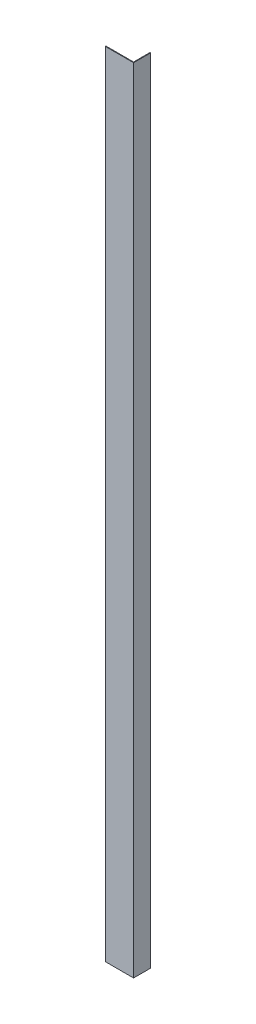
ISO-10303-21;
HEADER;
FILE_DESCRIPTION(('STEP AP214'),'2;1');
FILE_NAME('part.step','',(''),(''),'','','');
FILE_SCHEMA(('AUTOMOTIVE_DESIGN { 1 0 10303 214 1 1 1 1 }'));
ENDSEC;
DATA;
#1=APPLICATION_CONTEXT('core data for automotive mechanical design processes');
#2=APPLICATION_PROTOCOL_DEFINITION('international standard','automotive_design',2000,#1);
#3=PRODUCT_CONTEXT('',#1,'mechanical');
#4=PRODUCT('Part','Part','',(#3));
#5=PRODUCT_RELATED_PRODUCT_CATEGORY('part','',(#4));
#6=PRODUCT_DEFINITION_FORMATION('','',#4);
#7=PRODUCT_DEFINITION_CONTEXT('part definition',#1,'design');
#8=PRODUCT_DEFINITION('design','',#6,#7);
#9=PRODUCT_DEFINITION_SHAPE('','',#8);
#10=(LENGTH_UNIT() NAMED_UNIT(*) SI_UNIT(.MILLI.,.METRE.));
#11=(NAMED_UNIT(*) PLANE_ANGLE_UNIT() SI_UNIT($,.RADIAN.));
#12=(NAMED_UNIT(*) SI_UNIT($,.STERADIAN.) SOLID_ANGLE_UNIT());
#13=UNCERTAINTY_MEASURE_WITH_UNIT(LENGTH_MEASURE(1.E-05),#10,'distance_accuracy_value','');
#14=(GEOMETRIC_REPRESENTATION_CONTEXT(3) GLOBAL_UNCERTAINTY_ASSIGNED_CONTEXT((#13)) GLOBAL_UNIT_ASSIGNED_CONTEXT((#10,
#11,#12)) REPRESENTATION_CONTEXT('',''));
#15=CARTESIAN_POINT('',(0.,0.,0.));
#16=DIRECTION('',(0.,0.,1.));
#17=DIRECTION('',(1.,0.,0.));
#18=AXIS2_PLACEMENT_3D('',#15,#16,#17);
#19=CARTESIAN_POINT('',(66.,1970.,40.));
#20=DIRECTION('',(0.,0.,-1.));
#21=DIRECTION('',(-1.,0.,0.));
#22=AXIS2_PLACEMENT_3D('',#19,#20,#21);
#23=PLANE('',#22);
#24=DIRECTION('',(1.,0.,0.));
#25=VECTOR('',#24,1.);
#26=CARTESIAN_POINT('',(66.,120.,40.));
#27=LINE('',#26,#25);
#28=CARTESIAN_POINT('',(0.,120.,40.));
#29=VERTEX_POINT('',#28);
#30=CARTESIAN_POINT('',(66.,120.,40.));
#31=VERTEX_POINT('',#30);
#32=EDGE_CURVE('E123',#29,#31,#27,.T.);
#33=ORIENTED_EDGE('',*,*,#32,.T.);
#34=DIRECTION('',(0.,-1.,0.));
#35=VECTOR('',#34,1.);
#36=CARTESIAN_POINT('',(66.,1970.,40.));
#37=LINE('',#36,#35);
#38=CARTESIAN_POINT('',(66.,1970.,40.));
#39=VERTEX_POINT('',#38);
#40=EDGE_CURVE('E11',#39,#31,#37,.T.);
#41=ORIENTED_EDGE('',*,*,#40,.F.);
#42=DIRECTION('',(1.,0.,0.));
#43=VECTOR('',#42,1.);
#44=CARTESIAN_POINT('',(66.,1970.,40.));
#45=LINE('',#44,#43);
#46=CARTESIAN_POINT('',(0.,1970.,40.));
#47=VERTEX_POINT('',#46);
#48=EDGE_CURVE('E133',#47,#39,#45,.T.);
#49=ORIENTED_EDGE('',*,*,#48,.F.);
#50=DIRECTION('',(0.,-1.,0.));
#51=VECTOR('',#50,1.);
#52=CARTESIAN_POINT('',(0.,1970.,40.));
#53=LINE('',#52,#51);
#54=EDGE_CURVE('E119',#47,#29,#53,.T.);
#55=ORIENTED_EDGE('',*,*,#54,.T.);
#56=EDGE_LOOP('',(#33,#41,#49,#55));
#57=FACE_BOUND('',#56,.T.);
#58=ADVANCED_FACE('F39',(#57),#23,.F.);
#59=CARTESIAN_POINT('',(66.,1970.,0.));
#60=DIRECTION('',(-1.,0.,0.));
#61=DIRECTION('',(0.,0.,1.));
#62=AXIS2_PLACEMENT_3D('',#59,#60,#61);
#63=PLANE('',#62);
#64=DIRECTION('',(0.,0.,-1.));
#65=VECTOR('',#64,1.);
#66=CARTESIAN_POINT('',(66.,120.,0.));
#67=LINE('',#66,#65);
#68=CARTESIAN_POINT('',(66.,120.,0.));
#69=VERTEX_POINT('',#68);
#70=EDGE_CURVE('E126',#31,#69,#67,.T.);
#71=ORIENTED_EDGE('',*,*,#70,.T.);
#72=DIRECTION('',(0.,-1.,0.));
#73=VECTOR('',#72,1.);
#74=CARTESIAN_POINT('',(66.,1970.,0.));
#75=LINE('',#74,#73);
#76=CARTESIAN_POINT('',(66.,1970.,0.));
#77=VERTEX_POINT('',#76);
#78=EDGE_CURVE('E47',#77,#69,#75,.T.);
#79=ORIENTED_EDGE('',*,*,#78,.F.);
#80=DIRECTION('',(0.,0.,-1.));
#81=VECTOR('',#80,1.);
#82=CARTESIAN_POINT('',(66.,1970.,0.));
#83=LINE('',#82,#81);
#84=EDGE_CURVE('E92',#39,#77,#83,.T.);
#85=ORIENTED_EDGE('',*,*,#84,.F.);
#86=ORIENTED_EDGE('',*,*,#40,.T.);
#87=EDGE_LOOP('',(#71,#79,#85,#86));
#88=FACE_BOUND('',#87,.T.);
#89=ADVANCED_FACE('F157',(#88),#63,.F.);
#90=CARTESIAN_POINT('',(64.5,1970.,0.));
#91=DIRECTION('',(0.,0.,1.));
#92=DIRECTION('',(1.,0.,0.));
#93=AXIS2_PLACEMENT_3D('',#90,#91,#92);
#94=PLANE('',#93);
#95=DIRECTION('',(-1.,0.,0.));
#96=VECTOR('',#95,1.);
#97=CARTESIAN_POINT('',(64.5,120.,0.));
#98=LINE('',#97,#96);
#99=CARTESIAN_POINT('',(64.5,120.,0.));
#100=VERTEX_POINT('',#99);
#101=EDGE_CURVE('E128',#69,#100,#98,.T.);
#102=ORIENTED_EDGE('',*,*,#101,.T.);
#103=DIRECTION('',(0.,-1.,0.));
#104=VECTOR('',#103,1.);
#105=CARTESIAN_POINT('',(64.5,1970.,0.));
#106=LINE('',#105,#104);
#107=CARTESIAN_POINT('',(64.5,1970.,0.));
#108=VERTEX_POINT('',#107);
#109=EDGE_CURVE('E114',#108,#100,#106,.T.);
#110=ORIENTED_EDGE('',*,*,#109,.F.);
#111=DIRECTION('',(-1.,0.,0.));
#112=VECTOR('',#111,1.);
#113=CARTESIAN_POINT('',(64.5,1970.,0.));
#114=LINE('',#113,#112);
#115=EDGE_CURVE('E105',#77,#108,#114,.T.);
#116=ORIENTED_EDGE('',*,*,#115,.F.);
#117=ORIENTED_EDGE('',*,*,#78,.T.);
#118=EDGE_LOOP('',(#102,#110,#116,#117));
#119=FACE_BOUND('',#118,.T.);
#120=ADVANCED_FACE('F139',(#119),#94,.F.);
#121=CARTESIAN_POINT('',(64.5,1970.,38.5));
#122=DIRECTION('',(1.,0.,0.));
#123=DIRECTION('',(0.,0.,-1.));
#124=AXIS2_PLACEMENT_3D('',#121,#122,#123);
#125=PLANE('',#124);
#126=DIRECTION('',(0.,0.,1.));
#127=VECTOR('',#126,1.);
#128=CARTESIAN_POINT('',(64.5,120.,38.5));
#129=LINE('',#128,#127);
#130=CARTESIAN_POINT('',(64.5,120.,38.5));
#131=VERTEX_POINT('',#130);
#132=EDGE_CURVE('E113',#100,#131,#129,.T.);
#133=ORIENTED_EDGE('',*,*,#132,.T.);
#134=DIRECTION('',(0.,-1.,0.));
#135=VECTOR('',#134,1.);
#136=CARTESIAN_POINT('',(64.5,1970.,38.5));
#137=LINE('',#136,#135);
#138=CARTESIAN_POINT('',(64.5,1970.,38.5));
#139=VERTEX_POINT('',#138);
#140=EDGE_CURVE('E110',#139,#131,#137,.T.);
#141=ORIENTED_EDGE('',*,*,#140,.F.);
#142=DIRECTION('',(0.,0.,1.));
#143=VECTOR('',#142,1.);
#144=CARTESIAN_POINT('',(64.5,1970.,38.5));
#145=LINE('',#144,#143);
#146=EDGE_CURVE('E99',#108,#139,#145,.T.);
#147=ORIENTED_EDGE('',*,*,#146,.F.);
#148=ORIENTED_EDGE('',*,*,#109,.T.);
#149=EDGE_LOOP('',(#133,#141,#147,#148));
#150=FACE_BOUND('',#149,.T.);
#151=ADVANCED_FACE('F111',(#150),#125,.F.);
#152=CARTESIAN_POINT('',(0.,1970.,38.5));
#153=DIRECTION('',(0.,0.,1.));
#154=DIRECTION('',(1.,0.,0.));
#155=AXIS2_PLACEMENT_3D('',#152,#153,#154);
#156=PLANE('',#155);
#157=DIRECTION('',(-1.,0.,0.));
#158=VECTOR('',#157,1.);
#159=CARTESIAN_POINT('',(0.,120.,38.5));
#160=LINE('',#159,#158);
#161=CARTESIAN_POINT('',(0.,120.,38.5));
#162=VERTEX_POINT('',#161);
#163=EDGE_CURVE('E78',#131,#162,#160,.T.);
#164=ORIENTED_EDGE('',*,*,#163,.T.);
#165=DIRECTION('',(0.,-1.,0.));
#166=VECTOR('',#165,1.);
#167=CARTESIAN_POINT('',(0.,1970.,38.5));
#168=LINE('',#167,#166);
#169=CARTESIAN_POINT('',(0.,1970.,38.5));
#170=VERTEX_POINT('',#169);
#171=EDGE_CURVE('E115',#170,#162,#168,.T.);
#172=ORIENTED_EDGE('',*,*,#171,.F.);
#173=DIRECTION('',(-1.,0.,0.));
#174=VECTOR('',#173,1.);
#175=CARTESIAN_POINT('',(0.,1970.,38.5));
#176=LINE('',#175,#174);
#177=EDGE_CURVE('E103',#139,#170,#176,.T.);
#178=ORIENTED_EDGE('',*,*,#177,.F.);
#179=ORIENTED_EDGE('',*,*,#140,.T.);
#180=EDGE_LOOP('',(#164,#172,#178,#179));
#181=FACE_BOUND('',#180,.T.);
#182=ADVANCED_FACE('F117',(#181),#156,.F.);
#183=CARTESIAN_POINT('',(0.,1970.,40.));
#184=DIRECTION('',(1.,0.,0.));
#185=DIRECTION('',(0.,0.,-1.));
#186=AXIS2_PLACEMENT_3D('',#183,#184,#185);
#187=PLANE('',#186);
#188=DIRECTION('',(0.,0.,1.));
#189=VECTOR('',#188,1.);
#190=CARTESIAN_POINT('',(0.,120.,40.));
#191=LINE('',#190,#189);
#192=EDGE_CURVE('E84',#162,#29,#191,.T.);
#193=ORIENTED_EDGE('',*,*,#192,.T.);
#194=ORIENTED_EDGE('',*,*,#54,.F.);
#195=DIRECTION('',(0.,0.,1.));
#196=VECTOR('',#195,1.);
#197=CARTESIAN_POINT('',(0.,1970.,40.));
#198=LINE('',#197,#196);
#199=EDGE_CURVE('E55',#170,#47,#198,.T.);
#200=ORIENTED_EDGE('',*,*,#199,.F.);
#201=ORIENTED_EDGE('',*,*,#171,.T.);
#202=EDGE_LOOP('',(#193,#194,#200,#201));
#203=FACE_BOUND('',#202,.T.);
#204=ADVANCED_FACE('F146',(#203),#187,.F.);
#205=CARTESIAN_POINT('',(0.,1970.,0.));
#206=DIRECTION('',(0.,-1.,0.));
#207=DIRECTION('',(0.,0.,-1.));
#208=AXIS2_PLACEMENT_3D('',#205,#206,#207);
#209=PLANE('',#208);
#210=ORIENTED_EDGE('',*,*,#48,.T.);
#211=ORIENTED_EDGE('',*,*,#84,.T.);
#212=ORIENTED_EDGE('',*,*,#115,.T.);
#213=ORIENTED_EDGE('',*,*,#146,.T.);
#214=ORIENTED_EDGE('',*,*,#177,.T.);
#215=ORIENTED_EDGE('',*,*,#199,.T.);
#216=EDGE_LOOP('',(#210,#211,#212,#213,#214,#215));
#217=FACE_BOUND('',#216,.T.);
#218=ADVANCED_FACE('F101',(#217),#209,.F.);
#219=CARTESIAN_POINT('',(0.,120.,0.));
#220=DIRECTION('',(0.,-1.,0.));
#221=DIRECTION('',(0.,0.,-1.));
#222=AXIS2_PLACEMENT_3D('',#219,#220,#221);
#223=PLANE('',#222);
#224=ORIENTED_EDGE('',*,*,#32,.F.);
#225=ORIENTED_EDGE('',*,*,#192,.F.);
#226=ORIENTED_EDGE('',*,*,#163,.F.);
#227=ORIENTED_EDGE('',*,*,#132,.F.);
#228=ORIENTED_EDGE('',*,*,#101,.F.);
#229=ORIENTED_EDGE('',*,*,#70,.F.);
#230=EDGE_LOOP('',(#224,#225,#226,#227,#228,#229));
#231=FACE_BOUND('',#230,.T.);
#232=ADVANCED_FACE('F142',(#231),#223,.T.);
#233=CLOSED_SHELL('',(#58,#89,#120,#151,#182,#204,#218,#232));
#234=MANIFOLD_SOLID_BREP('B2',#233);
#235=ADVANCED_BREP_SHAPE_REPRESENTATION('',(#18,#234),#14);
#236=SHAPE_DEFINITION_REPRESENTATION(#9,#235);
ENDSEC;
END-ISO-10303-21;
